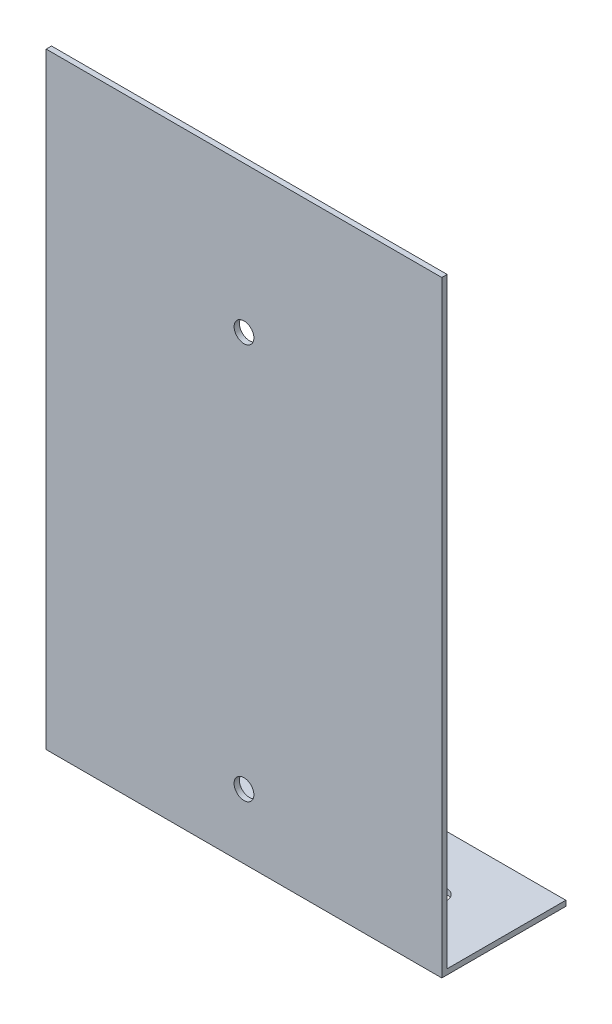
ISO-10303-21;
HEADER;
FILE_DESCRIPTION(('STEP AP214'),'2;1');
FILE_NAME('part.step','',(''),(''),'','','');
FILE_SCHEMA(('AUTOMOTIVE_DESIGN { 1 0 10303 214 1 1 1 1 }'));
ENDSEC;
DATA;
#1=APPLICATION_CONTEXT('core data for automotive mechanical design processes');
#2=APPLICATION_PROTOCOL_DEFINITION('international standard','automotive_design',2000,#1);
#3=PRODUCT_CONTEXT('',#1,'mechanical');
#4=PRODUCT('Part','Part','',(#3));
#5=PRODUCT_RELATED_PRODUCT_CATEGORY('part','',(#4));
#6=PRODUCT_DEFINITION_FORMATION('','',#4);
#7=PRODUCT_DEFINITION_CONTEXT('part definition',#1,'design');
#8=PRODUCT_DEFINITION('design','',#6,#7);
#9=PRODUCT_DEFINITION_SHAPE('','',#8);
#10=(LENGTH_UNIT() NAMED_UNIT(*) SI_UNIT(.MILLI.,.METRE.));
#11=(NAMED_UNIT(*) PLANE_ANGLE_UNIT() SI_UNIT($,.RADIAN.));
#12=(NAMED_UNIT(*) SI_UNIT($,.STERADIAN.) SOLID_ANGLE_UNIT());
#13=UNCERTAINTY_MEASURE_WITH_UNIT(LENGTH_MEASURE(1.E-05),#10,'distance_accuracy_value','');
#14=(GEOMETRIC_REPRESENTATION_CONTEXT(3) GLOBAL_UNCERTAINTY_ASSIGNED_CONTEXT((#13)) GLOBAL_UNIT_ASSIGNED_CONTEXT((#10,
#11,#12)) REPRESENTATION_CONTEXT('',''));
#15=CARTESIAN_POINT('',(0.,0.,0.));
#16=DIRECTION('',(0.,0.,1.));
#17=DIRECTION('',(1.,0.,0.));
#18=AXIS2_PLACEMENT_3D('',#15,#16,#17);
#19=CARTESIAN_POINT('',(0.,2.7,0.));
#20=DIRECTION('',(0.,1.,0.));
#21=DIRECTION('',(0.,0.,1.));
#22=AXIS2_PLACEMENT_3D('',#19,#20,#21);
#23=PLANE('',#22);
#24=CARTESIAN_POINT('',(35.,2.7,-30.));
#25=DIRECTION('',(0.,1.,0.));
#26=DIRECTION('',(0.,0.,1.));
#27=AXIS2_PLACEMENT_3D('',#24,#25,#26);
#28=CIRCLE('',#27,5.);
#29=CARTESIAN_POINT('',(35.,2.7,-35.));
#30=VERTEX_POINT('',#29);
#31=EDGE_CURVE('E110',#30,#30,#28,.T.);
#32=ORIENTED_EDGE('',*,*,#31,.F.);
#33=EDGE_LOOP('',(#32));
#34=FACE_BOUND('',#33,.T.);
#35=DIRECTION('',(0.,0.,1.));
#36=VECTOR('',#35,1.);
#37=CARTESIAN_POINT('',(0.,2.7,-60.));
#38=LINE('',#37,#36);
#39=CARTESIAN_POINT('',(0.,2.7,-60.));
#40=VERTEX_POINT('',#39);
#41=CARTESIAN_POINT('',(0.,2.7,0.));
#42=VERTEX_POINT('',#41);
#43=EDGE_CURVE('E100',#40,#42,#38,.T.);
#44=ORIENTED_EDGE('',*,*,#43,.T.);
#45=DIRECTION('',(1.,0.,0.));
#46=VECTOR('',#45,1.);
#47=CARTESIAN_POINT('',(0.,2.7,0.));
#48=LINE('',#47,#46);
#49=CARTESIAN_POINT('',(200.,2.7,0.));
#50=VERTEX_POINT('',#49);
#51=EDGE_CURVE('E77',#42,#50,#48,.T.);
#52=ORIENTED_EDGE('',*,*,#51,.T.);
#53=DIRECTION('',(0.,0.,-1.));
#54=VECTOR('',#53,1.);
#55=CARTESIAN_POINT('',(200.,2.7,-60.));
#56=LINE('',#55,#54);
#57=CARTESIAN_POINT('',(200.,2.7,-60.));
#58=VERTEX_POINT('',#57);
#59=EDGE_CURVE('E98',#50,#58,#56,.T.);
#60=ORIENTED_EDGE('',*,*,#59,.T.);
#61=DIRECTION('',(-1.,0.,0.));
#62=VECTOR('',#61,1.);
#63=CARTESIAN_POINT('',(0.,2.7,-60.));
#64=LINE('',#63,#62);
#65=EDGE_CURVE('E56',#58,#40,#64,.T.);
#66=ORIENTED_EDGE('',*,*,#65,.T.);
#67=EDGE_LOOP('',(#44,#52,#60,#66));
#68=FACE_BOUND('',#67,.T.);
#69=CARTESIAN_POINT('',(165.,2.7,-30.));
#70=DIRECTION('',(0.,1.,0.));
#71=DIRECTION('',(0.,0.,1.));
#72=AXIS2_PLACEMENT_3D('',#69,#70,#71);
#73=CIRCLE('',#72,5.00000000000002);
#74=CARTESIAN_POINT('',(165.,2.7,-35.));
#75=VERTEX_POINT('',#74);
#76=EDGE_CURVE('E155',#75,#75,#73,.T.);
#77=ORIENTED_EDGE('',*,*,#76,.F.);
#78=EDGE_LOOP('',(#77));
#79=FACE_BOUND('',#78,.T.);
#80=ADVANCED_FACE('F39',(#34,#68,#79),#23,.T.);
#81=CARTESIAN_POINT('',(0.,0.,0.));
#82=DIRECTION('',(0.,1.,0.));
#83=DIRECTION('',(0.,0.,1.));
#84=AXIS2_PLACEMENT_3D('',#81,#82,#83);
#85=PLANE('',#84);
#86=DIRECTION('',(0.,0.,1.));
#87=VECTOR('',#86,1.);
#88=CARTESIAN_POINT('',(0.,0.,-60.));
#89=LINE('',#88,#87);
#90=CARTESIAN_POINT('',(0.,0.,-60.));
#91=VERTEX_POINT('',#90);
#92=CARTESIAN_POINT('',(0.,0.,2.7));
#93=VERTEX_POINT('',#92);
#94=EDGE_CURVE('E107',#91,#93,#89,.T.);
#95=ORIENTED_EDGE('',*,*,#94,.F.);
#96=DIRECTION('',(-1.,0.,0.));
#97=VECTOR('',#96,1.);
#98=CARTESIAN_POINT('',(0.,0.,-60.));
#99=LINE('',#98,#97);
#100=CARTESIAN_POINT('',(200.,0.,-60.));
#101=VERTEX_POINT('',#100);
#102=EDGE_CURVE('E112',#101,#91,#99,.T.);
#103=ORIENTED_EDGE('',*,*,#102,.F.);
#104=DIRECTION('',(0.,0.,-1.));
#105=VECTOR('',#104,1.);
#106=CARTESIAN_POINT('',(200.,0.,-60.));
#107=LINE('',#106,#105);
#108=CARTESIAN_POINT('',(200.,0.,2.7));
#109=VERTEX_POINT('',#108);
#110=EDGE_CURVE('E68',#109,#101,#107,.T.);
#111=ORIENTED_EDGE('',*,*,#110,.F.);
#112=DIRECTION('',(1.,0.,0.));
#113=VECTOR('',#112,1.);
#114=CARTESIAN_POINT('',(0.,0.,2.7));
#115=LINE('',#114,#113);
#116=EDGE_CURVE('E125',#93,#109,#115,.T.);
#117=ORIENTED_EDGE('',*,*,#116,.F.);
#118=EDGE_LOOP('',(#95,#103,#111,#117));
#119=FACE_BOUND('',#118,.T.);
#120=CARTESIAN_POINT('',(35.,0.,-30.));
#121=DIRECTION('',(0.,1.,0.));
#122=DIRECTION('',(0.,0.,1.));
#123=AXIS2_PLACEMENT_3D('',#120,#121,#122);
#124=CIRCLE('',#123,5.);
#125=CARTESIAN_POINT('',(35.,0.,-35.));
#126=VERTEX_POINT('',#125);
#127=EDGE_CURVE('E158',#126,#126,#124,.T.);
#128=ORIENTED_EDGE('',*,*,#127,.T.);
#129=EDGE_LOOP('',(#128));
#130=FACE_BOUND('',#129,.T.);
#131=CARTESIAN_POINT('',(165.,0.,-30.));
#132=DIRECTION('',(0.,1.,0.));
#133=DIRECTION('',(0.,0.,1.));
#134=AXIS2_PLACEMENT_3D('',#131,#132,#133);
#135=CIRCLE('',#134,5.00000000000002);
#136=CARTESIAN_POINT('',(165.,0.,-35.));
#137=VERTEX_POINT('',#136);
#138=EDGE_CURVE('E154',#137,#137,#135,.T.);
#139=ORIENTED_EDGE('',*,*,#138,.T.);
#140=EDGE_LOOP('',(#139));
#141=FACE_BOUND('',#140,.T.);
#142=ADVANCED_FACE('F122',(#119,#130,#141),#85,.F.);
#143=CARTESIAN_POINT('',(0.,2.7,-60.));
#144=DIRECTION('',(1.,0.,0.));
#145=DIRECTION('',(0.,0.,-1.));
#146=AXIS2_PLACEMENT_3D('',#143,#144,#145);
#147=PLANE('',#146);
#148=ORIENTED_EDGE('',*,*,#94,.T.);
#149=DIRECTION('',(0.,-1.,0.));
#150=VECTOR('',#149,1.);
#151=CARTESIAN_POINT('',(0.,0.,2.7));
#152=LINE('',#151,#150);
#153=CARTESIAN_POINT('',(0.,306.7,2.7));
#154=VERTEX_POINT('',#153);
#155=EDGE_CURVE('E132',#154,#93,#152,.T.);
#156=ORIENTED_EDGE('',*,*,#155,.F.);
#157=DIRECTION('',(0.,0.,-1.));
#158=VECTOR('',#157,1.);
#159=CARTESIAN_POINT('',(0.,306.7,2.7));
#160=LINE('',#159,#158);
#161=CARTESIAN_POINT('',(0.,306.7,0.));
#162=VERTEX_POINT('',#161);
#163=EDGE_CURVE('E148',#154,#162,#160,.T.);
#164=ORIENTED_EDGE('',*,*,#163,.T.);
#165=DIRECTION('',(0.,-1.,0.));
#166=VECTOR('',#165,1.);
#167=CARTESIAN_POINT('',(0.,0.,0.));
#168=LINE('',#167,#166);
#169=EDGE_CURVE('E95',#162,#42,#168,.T.);
#170=ORIENTED_EDGE('',*,*,#169,.T.);
#171=ORIENTED_EDGE('',*,*,#43,.F.);
#172=DIRECTION('',(0.,-1.,0.));
#173=VECTOR('',#172,1.);
#174=CARTESIAN_POINT('',(0.,2.7,-60.));
#175=LINE('',#174,#173);
#176=EDGE_CURVE('E48',#40,#91,#175,.T.);
#177=ORIENTED_EDGE('',*,*,#176,.T.);
#178=EDGE_LOOP('',(#148,#156,#164,#170,#171,#177));
#179=FACE_BOUND('',#178,.T.);
#180=ADVANCED_FACE('F41',(#179),#147,.F.);
#181=CARTESIAN_POINT('',(200.,2.7,-60.));
#182=DIRECTION('',(-1.,0.,0.));
#183=DIRECTION('',(0.,0.,1.));
#184=AXIS2_PLACEMENT_3D('',#181,#182,#183);
#185=PLANE('',#184);
#186=ORIENTED_EDGE('',*,*,#110,.T.);
#187=DIRECTION('',(0.,-1.,0.));
#188=VECTOR('',#187,1.);
#189=CARTESIAN_POINT('',(200.,2.7,-60.));
#190=LINE('',#189,#188);
#191=EDGE_CURVE('E11',#58,#101,#190,.T.);
#192=ORIENTED_EDGE('',*,*,#191,.F.);
#193=ORIENTED_EDGE('',*,*,#59,.F.);
#194=DIRECTION('',(0.,1.,0.));
#195=VECTOR('',#194,1.);
#196=CARTESIAN_POINT('',(200.,0.,0.));
#197=LINE('',#196,#195);
#198=CARTESIAN_POINT('',(200.,306.7,0.));
#199=VERTEX_POINT('',#198);
#200=EDGE_CURVE('E87',#50,#199,#197,.T.);
#201=ORIENTED_EDGE('',*,*,#200,.T.);
#202=DIRECTION('',(0.,0.,-1.));
#203=VECTOR('',#202,1.);
#204=CARTESIAN_POINT('',(200.,306.7,2.7));
#205=LINE('',#204,#203);
#206=CARTESIAN_POINT('',(200.,306.7,2.7));
#207=VERTEX_POINT('',#206);
#208=EDGE_CURVE('E152',#207,#199,#205,.T.);
#209=ORIENTED_EDGE('',*,*,#208,.F.);
#210=DIRECTION('',(0.,1.,0.));
#211=VECTOR('',#210,1.);
#212=CARTESIAN_POINT('',(200.,0.,2.7));
#213=LINE('',#212,#211);
#214=EDGE_CURVE('E131',#109,#207,#213,.T.);
#215=ORIENTED_EDGE('',*,*,#214,.F.);
#216=EDGE_LOOP('',(#186,#192,#193,#201,#209,#215));
#217=FACE_BOUND('',#216,.T.);
#218=ADVANCED_FACE('F102',(#217),#185,.F.);
#219=CARTESIAN_POINT('',(0.,2.7,-60.));
#220=DIRECTION('',(0.,0.,1.));
#221=DIRECTION('',(1.,0.,0.));
#222=AXIS2_PLACEMENT_3D('',#219,#220,#221);
#223=PLANE('',#222);
#224=ORIENTED_EDGE('',*,*,#102,.T.);
#225=ORIENTED_EDGE('',*,*,#176,.F.);
#226=ORIENTED_EDGE('',*,*,#65,.F.);
#227=ORIENTED_EDGE('',*,*,#191,.T.);
#228=EDGE_LOOP('',(#224,#225,#226,#227));
#229=FACE_BOUND('',#228,.T.);
#230=ADVANCED_FACE('F170',(#229),#223,.F.);
#231=CARTESIAN_POINT('',(35.,2.7,-30.));
#232=DIRECTION('',(0.,-1.,0.));
#233=DIRECTION('',(0.,0.,-1.));
#234=AXIS2_PLACEMENT_3D('',#231,#232,#233);
#235=CYLINDRICAL_SURFACE('',#234,5.);
#236=CARTESIAN_POINT('',(35.,2.7,-35.));
#237=CARTESIAN_POINT('',(35.,2.671875,-35.));
#238=CARTESIAN_POINT('',(35.,2.64375,-35.));
#239=CARTESIAN_POINT('',(35.,2.5875,-35.));
#240=CARTESIAN_POINT('',(35.,2.559375,-35.));
#241=CARTESIAN_POINT('',(35.,2.503125,-35.));
#242=CARTESIAN_POINT('',(35.,2.475,-35.));
#243=CARTESIAN_POINT('',(35.,2.41875,-35.));
#244=CARTESIAN_POINT('',(35.,2.390625,-35.));
#245=CARTESIAN_POINT('',(35.,2.334375,-35.));
#246=CARTESIAN_POINT('',(35.,2.30625,-35.));
#247=CARTESIAN_POINT('',(35.,2.25,-35.));
#248=CARTESIAN_POINT('',(35.,2.221875,-35.));
#249=CARTESIAN_POINT('',(35.,2.165625,-35.));
#250=CARTESIAN_POINT('',(35.,2.1375,-35.));
#251=CARTESIAN_POINT('',(35.,2.08125,-35.));
#252=CARTESIAN_POINT('',(35.,2.053125,-35.));
#253=CARTESIAN_POINT('',(35.,1.996875,-35.));
#254=CARTESIAN_POINT('',(35.,1.96875,-35.));
#255=CARTESIAN_POINT('',(35.,1.9125,-35.));
#256=CARTESIAN_POINT('',(35.,1.884375,-35.));
#257=CARTESIAN_POINT('',(35.,1.828125,-35.));
#258=CARTESIAN_POINT('',(35.,1.8,-35.));
#259=CARTESIAN_POINT('',(35.,1.74375,-35.));
#260=CARTESIAN_POINT('',(35.,1.715625,-35.));
#261=CARTESIAN_POINT('',(35.,1.659375,-35.));
#262=CARTESIAN_POINT('',(35.,1.63125,-35.));
#263=CARTESIAN_POINT('',(35.,1.575,-35.));
#264=CARTESIAN_POINT('',(35.,1.546875,-35.));
#265=CARTESIAN_POINT('',(35.,1.490625,-35.));
#266=CARTESIAN_POINT('',(35.,1.4625,-35.));
#267=CARTESIAN_POINT('',(35.,1.40625,-35.));
#268=CARTESIAN_POINT('',(35.,1.378125,-35.));
#269=CARTESIAN_POINT('',(35.,1.321875,-35.));
#270=CARTESIAN_POINT('',(35.,1.29375,-35.));
#271=CARTESIAN_POINT('',(35.,1.2375,-35.));
#272=CARTESIAN_POINT('',(35.,1.209375,-35.));
#273=CARTESIAN_POINT('',(35.,1.153125,-35.));
#274=CARTESIAN_POINT('',(35.,1.125,-35.));
#275=CARTESIAN_POINT('',(35.,1.06875,-35.));
#276=CARTESIAN_POINT('',(35.,1.040625,-35.));
#277=CARTESIAN_POINT('',(35.,0.984375,-35.));
#278=CARTESIAN_POINT('',(35.,0.95625,-35.));
#279=CARTESIAN_POINT('',(35.,0.9,-35.));
#280=CARTESIAN_POINT('',(35.,0.871875,-35.));
#281=CARTESIAN_POINT('',(35.,0.815625,-35.));
#282=CARTESIAN_POINT('',(35.,0.7875,-35.));
#283=CARTESIAN_POINT('',(35.,0.73125,-35.));
#284=CARTESIAN_POINT('',(35.,0.703125,-35.));
#285=CARTESIAN_POINT('',(35.,0.646875,-35.));
#286=CARTESIAN_POINT('',(35.,0.61875,-35.));
#287=CARTESIAN_POINT('',(35.,0.5625,-35.));
#288=CARTESIAN_POINT('',(35.,0.534375,-35.));
#289=CARTESIAN_POINT('',(35.,0.478125,-35.));
#290=CARTESIAN_POINT('',(35.,0.45,-35.));
#291=CARTESIAN_POINT('',(35.,0.39375,-35.));
#292=CARTESIAN_POINT('',(35.,0.365625,-35.));
#293=CARTESIAN_POINT('',(35.,0.309375,-35.));
#294=CARTESIAN_POINT('',(35.,0.28125,-35.));
#295=CARTESIAN_POINT('',(35.,0.225,-35.));
#296=CARTESIAN_POINT('',(35.,0.196875,-35.));
#297=CARTESIAN_POINT('',(35.,0.140625,-35.));
#298=CARTESIAN_POINT('',(35.,0.112499999999999,-35.));
#299=CARTESIAN_POINT('',(35.,0.0562499999999994,-35.));
#300=CARTESIAN_POINT('',(35.,0.0281249999999995,-35.));
#301=CARTESIAN_POINT('',(35.,0.,-35.));
#302=B_SPLINE_CURVE_WITH_KNOTS('',3,(#236,#237,#238,#239,#240,#241,#242,#243,#244,#245,#246,
#247,#248,#249,#250,#251,#252,#253,#254,#255,#256,#257,#258,#259,#260,#261,#262,#263,#264,#265,
#266,#267,#268,#269,#270,#271,#272,#273,#274,#275,#276,#277,#278,#279,#280,#281,#282,#283,#284,
#285,#286,#287,#288,#289,#290,#291,#292,#293,#294,#295,#296,#297,#298,#299,#300,#301),
.UNSPECIFIED.,.F.,.F.,(4,2,2,2,2,2,2,2,2,2,2,2,2,2,2,2,2,2,2,2,2,2,2,2,2,2,2,2,2,2,2,2,4),(0.,
0.0843749999999998,0.16875,0.253125,0.3375,0.421875,0.50625,0.590625,0.675,0.759375,0.84375,
0.928125,1.0125,1.096875,1.18125,1.265625,1.35,1.434375,1.51875,1.603125,1.6875,1.771875,
1.85625,1.940625,2.025,2.109375,2.19375,2.278125,2.3625,2.446875,2.53125,2.615625,2.7),.UNSPECIFIED.);
#303=EDGE_CURVE('BSEAM167',#30,#126,#302,.T.);
#304=ORIENTED_EDGE('',*,*,#31,.T.);
#305=ORIENTED_EDGE('',*,*,#127,.F.);
#306=ORIENTED_EDGE('',*,*,#303,.T.);
#307=ORIENTED_EDGE('',*,*,#303,.F.);
#308=EDGE_LOOP('',(#304,#306,#305,#307));
#309=FACE_BOUND('',#308,.T.);
#310=ADVANCED_FACE('F167',(#309),#235,.F.);
#311=CARTESIAN_POINT('',(165.,2.7,-30.));
#312=DIRECTION('',(0.,-1.,0.));
#313=DIRECTION('',(0.,0.,-1.));
#314=AXIS2_PLACEMENT_3D('',#311,#312,#313);
#315=CYLINDRICAL_SURFACE('',#314,5.00000000000002);
#316=CARTESIAN_POINT('',(165.,2.7,-35.));
#317=CARTESIAN_POINT('',(165.,2.671875,-35.));
#318=CARTESIAN_POINT('',(165.,2.64375,-35.));
#319=CARTESIAN_POINT('',(165.,2.5875,-35.));
#320=CARTESIAN_POINT('',(165.,2.559375,-35.));
#321=CARTESIAN_POINT('',(165.,2.503125,-35.));
#322=CARTESIAN_POINT('',(165.,2.475,-35.));
#323=CARTESIAN_POINT('',(165.,2.41875,-35.));
#324=CARTESIAN_POINT('',(165.,2.390625,-35.));
#325=CARTESIAN_POINT('',(165.,2.334375,-35.));
#326=CARTESIAN_POINT('',(165.,2.30625,-35.));
#327=CARTESIAN_POINT('',(165.,2.25,-35.));
#328=CARTESIAN_POINT('',(165.,2.221875,-35.));
#329=CARTESIAN_POINT('',(165.,2.165625,-35.));
#330=CARTESIAN_POINT('',(165.,2.1375,-35.));
#331=CARTESIAN_POINT('',(165.,2.08125,-35.));
#332=CARTESIAN_POINT('',(165.,2.053125,-35.));
#333=CARTESIAN_POINT('',(165.,1.996875,-35.));
#334=CARTESIAN_POINT('',(165.,1.96875,-35.));
#335=CARTESIAN_POINT('',(165.,1.9125,-35.));
#336=CARTESIAN_POINT('',(165.,1.884375,-35.));
#337=CARTESIAN_POINT('',(165.,1.828125,-35.));
#338=CARTESIAN_POINT('',(165.,1.8,-35.));
#339=CARTESIAN_POINT('',(165.,1.74375,-35.));
#340=CARTESIAN_POINT('',(165.,1.715625,-35.));
#341=CARTESIAN_POINT('',(165.,1.659375,-35.));
#342=CARTESIAN_POINT('',(165.,1.63125,-35.));
#343=CARTESIAN_POINT('',(165.,1.575,-35.));
#344=CARTESIAN_POINT('',(165.,1.546875,-35.));
#345=CARTESIAN_POINT('',(165.,1.490625,-35.));
#346=CARTESIAN_POINT('',(165.,1.4625,-35.));
#347=CARTESIAN_POINT('',(165.,1.40625,-35.));
#348=CARTESIAN_POINT('',(165.,1.378125,-35.));
#349=CARTESIAN_POINT('',(165.,1.321875,-35.));
#350=CARTESIAN_POINT('',(165.,1.29375,-35.));
#351=CARTESIAN_POINT('',(165.,1.2375,-35.));
#352=CARTESIAN_POINT('',(165.,1.209375,-35.));
#353=CARTESIAN_POINT('',(165.,1.153125,-35.));
#354=CARTESIAN_POINT('',(165.,1.125,-35.));
#355=CARTESIAN_POINT('',(165.,1.06875,-35.));
#356=CARTESIAN_POINT('',(165.,1.040625,-35.));
#357=CARTESIAN_POINT('',(165.,0.984375,-35.));
#358=CARTESIAN_POINT('',(165.,0.95625,-35.));
#359=CARTESIAN_POINT('',(165.,0.9,-35.));
#360=CARTESIAN_POINT('',(165.,0.871875,-35.));
#361=CARTESIAN_POINT('',(165.,0.815625,-35.));
#362=CARTESIAN_POINT('',(165.,0.7875,-35.));
#363=CARTESIAN_POINT('',(165.,0.73125,-35.));
#364=CARTESIAN_POINT('',(165.,0.703125,-35.));
#365=CARTESIAN_POINT('',(165.,0.646875,-35.));
#366=CARTESIAN_POINT('',(165.,0.61875,-35.));
#367=CARTESIAN_POINT('',(165.,0.5625,-35.));
#368=CARTESIAN_POINT('',(165.,0.534375,-35.));
#369=CARTESIAN_POINT('',(165.,0.478125,-35.));
#370=CARTESIAN_POINT('',(165.,0.45,-35.));
#371=CARTESIAN_POINT('',(165.,0.39375,-35.));
#372=CARTESIAN_POINT('',(165.,0.365625,-35.));
#373=CARTESIAN_POINT('',(165.,0.309375,-35.));
#374=CARTESIAN_POINT('',(165.,0.28125,-35.));
#375=CARTESIAN_POINT('',(165.,0.225,-35.));
#376=CARTESIAN_POINT('',(165.,0.196875,-35.));
#377=CARTESIAN_POINT('',(165.,0.140625,-35.));
#378=CARTESIAN_POINT('',(165.,0.112499999999999,-35.));
#379=CARTESIAN_POINT('',(165.,0.0562499999999994,-35.));
#380=CARTESIAN_POINT('',(165.,0.0281249999999995,-35.));
#381=CARTESIAN_POINT('',(165.,0.,-35.));
#382=B_SPLINE_CURVE_WITH_KNOTS('',3,(#316,#317,#318,#319,#320,#321,#322,#323,#324,#325,#326,
#327,#328,#329,#330,#331,#332,#333,#334,#335,#336,#337,#338,#339,#340,#341,#342,#343,#344,#345,
#346,#347,#348,#349,#350,#351,#352,#353,#354,#355,#356,#357,#358,#359,#360,#361,#362,#363,#364,
#365,#366,#367,#368,#369,#370,#371,#372,#373,#374,#375,#376,#377,#378,#379,#380,#381),
.UNSPECIFIED.,.F.,.F.,(4,2,2,2,2,2,2,2,2,2,2,2,2,2,2,2,2,2,2,2,2,2,2,2,2,2,2,2,2,2,2,2,4),(0.,
0.0843749999999998,0.16875,0.253125,0.3375,0.421875,0.50625,0.590625,0.675,0.759375,0.84375,
0.928125,1.0125,1.096875,1.18125,1.265625,1.35,1.434375,1.51875,1.603125,1.6875,1.771875,
1.85625,1.940625,2.025,2.109375,2.19375,2.278125,2.3625,2.446875,2.53125,2.615625,2.7),.UNSPECIFIED.);
#383=EDGE_CURVE('BSEAM169',#75,#137,#382,.T.);
#384=ORIENTED_EDGE('',*,*,#76,.T.);
#385=ORIENTED_EDGE('',*,*,#138,.F.);
#386=ORIENTED_EDGE('',*,*,#383,.T.);
#387=ORIENTED_EDGE('',*,*,#383,.F.);
#388=EDGE_LOOP('',(#384,#386,#385,#387));
#389=FACE_BOUND('',#388,.T.);
#390=ADVANCED_FACE('F169',(#389),#315,.F.);
#391=CARTESIAN_POINT('',(0.,0.,0.));
#392=DIRECTION('',(0.,0.,-1.));
#393=DIRECTION('',(-1.,0.,0.));
#394=AXIS2_PLACEMENT_3D('',#391,#392,#393);
#395=PLANE('',#394);
#396=CARTESIAN_POINT('',(100.,32.7,0.));
#397=DIRECTION('',(0.,0.,1.));
#398=DIRECTION('',(1.,0.,0.));
#399=AXIS2_PLACEMENT_3D('',#396,#397,#398);
#400=CIRCLE('',#399,5.00000000000001);
#401=CARTESIAN_POINT('',(95.,32.7,0.));
#402=VERTEX_POINT('',#401);
#403=EDGE_CURVE('E312',#402,#402,#400,.T.);
#404=ORIENTED_EDGE('',*,*,#403,.T.);
#405=EDGE_LOOP('',(#404));
#406=FACE_BOUND('',#405,.T.);
#407=CARTESIAN_POINT('',(100.,232.7,0.));
#408=DIRECTION('',(0.,0.,1.));
#409=DIRECTION('',(1.,0.,0.));
#410=AXIS2_PLACEMENT_3D('',#407,#408,#409);
#411=CIRCLE('',#410,5.00000000000001);
#412=CARTESIAN_POINT('',(95.,232.7,0.));
#413=VERTEX_POINT('',#412);
#414=EDGE_CURVE('E143',#413,#413,#411,.T.);
#415=ORIENTED_EDGE('',*,*,#414,.T.);
#416=EDGE_LOOP('',(#415));
#417=FACE_BOUND('',#416,.T.);
#418=ORIENTED_EDGE('',*,*,#51,.F.);
#419=ORIENTED_EDGE('',*,*,#169,.F.);
#420=DIRECTION('',(-1.,0.,0.));
#421=VECTOR('',#420,1.);
#422=CARTESIAN_POINT('',(0.,306.7,0.));
#423=LINE('',#422,#421);
#424=EDGE_CURVE('E91',#199,#162,#423,.T.);
#425=ORIENTED_EDGE('',*,*,#424,.F.);
#426=ORIENTED_EDGE('',*,*,#200,.F.);
#427=EDGE_LOOP('',(#418,#419,#425,#426));
#428=FACE_BOUND('',#427,.T.);
#429=ADVANCED_FACE('F88',(#406,#417,#428),#395,.T.);
#430=CARTESIAN_POINT('',(0.,0.,2.7));
#431=DIRECTION('',(0.,0.,-1.));
#432=DIRECTION('',(-1.,0.,0.));
#433=AXIS2_PLACEMENT_3D('',#430,#431,#432);
#434=PLANE('',#433);
#435=ORIENTED_EDGE('',*,*,#155,.T.);
#436=ORIENTED_EDGE('',*,*,#116,.T.);
#437=ORIENTED_EDGE('',*,*,#214,.T.);
#438=DIRECTION('',(-1.,0.,0.));
#439=VECTOR('',#438,1.);
#440=CARTESIAN_POINT('',(0.,306.7,2.7));
#441=LINE('',#440,#439);
#442=EDGE_CURVE('E137',#207,#154,#441,.T.);
#443=ORIENTED_EDGE('',*,*,#442,.T.);
#444=EDGE_LOOP('',(#435,#436,#437,#443));
#445=FACE_BOUND('',#444,.T.);
#446=CARTESIAN_POINT('',(100.,232.7,2.7));
#447=DIRECTION('',(0.,0.,1.));
#448=DIRECTION('',(1.,0.,0.));
#449=AXIS2_PLACEMENT_3D('',#446,#447,#448);
#450=CIRCLE('',#449,5.00000000000001);
#451=CARTESIAN_POINT('',(95.,232.7,2.7));
#452=VERTEX_POINT('',#451);
#453=EDGE_CURVE('E149',#452,#452,#450,.T.);
#454=ORIENTED_EDGE('',*,*,#453,.F.);
#455=EDGE_LOOP('',(#454));
#456=FACE_BOUND('',#455,.T.);
#457=CARTESIAN_POINT('',(100.,32.7,2.7));
#458=DIRECTION('',(0.,0.,1.));
#459=DIRECTION('',(1.,0.,0.));
#460=AXIS2_PLACEMENT_3D('',#457,#458,#459);
#461=CIRCLE('',#460,5.00000000000001);
#462=CARTESIAN_POINT('',(95.,32.7,2.7));
#463=VERTEX_POINT('',#462);
#464=EDGE_CURVE('E309',#463,#463,#461,.T.);
#465=ORIENTED_EDGE('',*,*,#464,.F.);
#466=EDGE_LOOP('',(#465));
#467=FACE_BOUND('',#466,.T.);
#468=ADVANCED_FACE('F134',(#445,#456,#467),#434,.F.);
#469=CARTESIAN_POINT('',(0.,306.7,2.7));
#470=DIRECTION('',(0.,-1.,0.));
#471=DIRECTION('',(0.,0.,-1.));
#472=AXIS2_PLACEMENT_3D('',#469,#470,#471);
#473=PLANE('',#472);
#474=ORIENTED_EDGE('',*,*,#424,.T.);
#475=ORIENTED_EDGE('',*,*,#163,.F.);
#476=ORIENTED_EDGE('',*,*,#442,.F.);
#477=ORIENTED_EDGE('',*,*,#208,.T.);
#478=EDGE_LOOP('',(#474,#475,#476,#477));
#479=FACE_BOUND('',#478,.T.);
#480=ADVANCED_FACE('F266',(#479),#473,.F.);
#481=CARTESIAN_POINT('',(100.,232.7,2.7));
#482=DIRECTION('',(0.,0.,-1.));
#483=DIRECTION('',(-1.,0.,0.));
#484=AXIS2_PLACEMENT_3D('',#481,#482,#483);
#485=CYLINDRICAL_SURFACE('',#484,5.00000000000001);
#486=CARTESIAN_POINT('',(95.,232.7,2.7));
#487=CARTESIAN_POINT('',(95.,232.7,2.671875));
#488=CARTESIAN_POINT('',(95.,232.7,2.64375));
#489=CARTESIAN_POINT('',(95.,232.7,2.5875));
#490=CARTESIAN_POINT('',(95.,232.7,2.559375));
#491=CARTESIAN_POINT('',(95.,232.7,2.503125));
#492=CARTESIAN_POINT('',(95.,232.7,2.475));
#493=CARTESIAN_POINT('',(95.,232.7,2.41875));
#494=CARTESIAN_POINT('',(95.,232.7,2.390625));
#495=CARTESIAN_POINT('',(95.,232.7,2.334375));
#496=CARTESIAN_POINT('',(95.,232.7,2.30625));
#497=CARTESIAN_POINT('',(95.,232.7,2.25));
#498=CARTESIAN_POINT('',(95.,232.7,2.221875));
#499=CARTESIAN_POINT('',(95.,232.7,2.165625));
#500=CARTESIAN_POINT('',(95.,232.7,2.1375));
#501=CARTESIAN_POINT('',(95.,232.7,2.08125));
#502=CARTESIAN_POINT('',(95.,232.7,2.053125));
#503=CARTESIAN_POINT('',(95.,232.7,1.996875));
#504=CARTESIAN_POINT('',(95.,232.7,1.96875));
#505=CARTESIAN_POINT('',(95.,232.7,1.9125));
#506=CARTESIAN_POINT('',(95.,232.7,1.884375));
#507=CARTESIAN_POINT('',(95.,232.7,1.828125));
#508=CARTESIAN_POINT('',(95.,232.7,1.8));
#509=CARTESIAN_POINT('',(95.,232.7,1.74375));
#510=CARTESIAN_POINT('',(95.,232.7,1.715625));
#511=CARTESIAN_POINT('',(95.,232.7,1.659375));
#512=CARTESIAN_POINT('',(95.,232.7,1.63125));
#513=CARTESIAN_POINT('',(95.,232.7,1.575));
#514=CARTESIAN_POINT('',(95.,232.7,1.546875));
#515=CARTESIAN_POINT('',(95.,232.7,1.490625));
#516=CARTESIAN_POINT('',(95.,232.7,1.4625));
#517=CARTESIAN_POINT('',(95.,232.7,1.40625));
#518=CARTESIAN_POINT('',(95.,232.7,1.378125));
#519=CARTESIAN_POINT('',(95.,232.7,1.321875));
#520=CARTESIAN_POINT('',(95.,232.7,1.29375));
#521=CARTESIAN_POINT('',(95.,232.7,1.2375));
#522=CARTESIAN_POINT('',(95.,232.7,1.209375));
#523=CARTESIAN_POINT('',(95.,232.7,1.153125));
#524=CARTESIAN_POINT('',(95.,232.7,1.125));
#525=CARTESIAN_POINT('',(95.,232.7,1.06875));
#526=CARTESIAN_POINT('',(95.,232.7,1.040625));
#527=CARTESIAN_POINT('',(95.,232.7,0.984375));
#528=CARTESIAN_POINT('',(95.,232.7,0.95625));
#529=CARTESIAN_POINT('',(95.,232.7,0.9));
#530=CARTESIAN_POINT('',(95.,232.7,0.871875));
#531=CARTESIAN_POINT('',(95.,232.7,0.815625));
#532=CARTESIAN_POINT('',(95.,232.7,0.7875));
#533=CARTESIAN_POINT('',(95.,232.7,0.73125));
#534=CARTESIAN_POINT('',(95.,232.7,0.703125));
#535=CARTESIAN_POINT('',(95.,232.7,0.646875));
#536=CARTESIAN_POINT('',(95.,232.7,0.61875));
#537=CARTESIAN_POINT('',(95.,232.7,0.5625));
#538=CARTESIAN_POINT('',(95.,232.7,0.534375));
#539=CARTESIAN_POINT('',(95.,232.7,0.478125));
#540=CARTESIAN_POINT('',(95.,232.7,0.45));
#541=CARTESIAN_POINT('',(95.,232.7,0.39375));
#542=CARTESIAN_POINT('',(95.,232.7,0.365625));
#543=CARTESIAN_POINT('',(95.,232.7,0.309375));
#544=CARTESIAN_POINT('',(95.,232.7,0.28125));
#545=CARTESIAN_POINT('',(95.,232.7,0.225));
#546=CARTESIAN_POINT('',(95.,232.7,0.196875));
#547=CARTESIAN_POINT('',(95.,232.7,0.140625));
#548=CARTESIAN_POINT('',(95.,232.7,0.112499999999999));
#549=CARTESIAN_POINT('',(95.,232.7,0.0562499999999994));
#550=CARTESIAN_POINT('',(95.,232.7,0.0281249999999995));
#551=CARTESIAN_POINT('',(95.,232.7,0.));
#552=B_SPLINE_CURVE_WITH_KNOTS('',3,(#486,#487,#488,#489,#490,#491,#492,#493,#494,#495,#496,
#497,#498,#499,#500,#501,#502,#503,#504,#505,#506,#507,#508,#509,#510,#511,#512,#513,#514,#515,
#516,#517,#518,#519,#520,#521,#522,#523,#524,#525,#526,#527,#528,#529,#530,#531,#532,#533,#534,
#535,#536,#537,#538,#539,#540,#541,#542,#543,#544,#545,#546,#547,#548,#549,#550,#551),
.UNSPECIFIED.,.F.,.F.,(4,2,2,2,2,2,2,2,2,2,2,2,2,2,2,2,2,2,2,2,2,2,2,2,2,2,2,2,2,2,2,2,4),(0.,
0.0843749999999998,0.16875,0.253125,0.3375,0.421875,0.50625,0.590625,0.675,0.759375,0.84375,
0.928125,1.0125,1.096875,1.18125,1.265625,1.35,1.434375,1.51875,1.603125,1.6875,1.771875,
1.85625,1.940625,2.025,2.109375,2.19375,2.278125,2.3625,2.446875,2.53125,2.615625,2.7),.UNSPECIFIED.);
#553=EDGE_CURVE('BSEAM276',#452,#413,#552,.T.);
#554=ORIENTED_EDGE('',*,*,#453,.T.);
#555=ORIENTED_EDGE('',*,*,#414,.F.);
#556=ORIENTED_EDGE('',*,*,#553,.T.);
#557=ORIENTED_EDGE('',*,*,#553,.F.);
#558=EDGE_LOOP('',(#554,#556,#555,#557));
#559=FACE_BOUND('',#558,.T.);
#560=ADVANCED_FACE('F276',(#559),#485,.F.);
#561=CARTESIAN_POINT('',(100.,32.7,2.7));
#562=DIRECTION('',(0.,0.,-1.));
#563=DIRECTION('',(-1.,0.,0.));
#564=AXIS2_PLACEMENT_3D('',#561,#562,#563);
#565=CYLINDRICAL_SURFACE('',#564,5.00000000000001);
#566=CARTESIAN_POINT('',(95.,32.7,2.7));
#567=CARTESIAN_POINT('',(95.,32.7,2.671875));
#568=CARTESIAN_POINT('',(95.,32.7,2.64375));
#569=CARTESIAN_POINT('',(95.,32.7,2.5875));
#570=CARTESIAN_POINT('',(95.,32.7,2.559375));
#571=CARTESIAN_POINT('',(95.,32.7,2.503125));
#572=CARTESIAN_POINT('',(95.,32.7,2.475));
#573=CARTESIAN_POINT('',(95.,32.7,2.41875));
#574=CARTESIAN_POINT('',(95.,32.7,2.390625));
#575=CARTESIAN_POINT('',(95.,32.7,2.334375));
#576=CARTESIAN_POINT('',(95.,32.7,2.30625));
#577=CARTESIAN_POINT('',(95.,32.7,2.25));
#578=CARTESIAN_POINT('',(95.,32.7,2.221875));
#579=CARTESIAN_POINT('',(95.,32.7,2.165625));
#580=CARTESIAN_POINT('',(95.,32.7,2.1375));
#581=CARTESIAN_POINT('',(95.,32.7,2.08125));
#582=CARTESIAN_POINT('',(95.,32.7,2.053125));
#583=CARTESIAN_POINT('',(95.,32.7,1.996875));
#584=CARTESIAN_POINT('',(95.,32.7,1.96875));
#585=CARTESIAN_POINT('',(95.,32.7,1.9125));
#586=CARTESIAN_POINT('',(95.,32.7,1.884375));
#587=CARTESIAN_POINT('',(95.,32.7,1.828125));
#588=CARTESIAN_POINT('',(95.,32.7,1.8));
#589=CARTESIAN_POINT('',(95.,32.7,1.74375));
#590=CARTESIAN_POINT('',(95.,32.7,1.715625));
#591=CARTESIAN_POINT('',(95.,32.7,1.659375));
#592=CARTESIAN_POINT('',(95.,32.7,1.63125));
#593=CARTESIAN_POINT('',(95.,32.7,1.575));
#594=CARTESIAN_POINT('',(95.,32.7,1.546875));
#595=CARTESIAN_POINT('',(95.,32.7,1.490625));
#596=CARTESIAN_POINT('',(95.,32.7,1.4625));
#597=CARTESIAN_POINT('',(95.,32.7,1.40625));
#598=CARTESIAN_POINT('',(95.,32.7,1.378125));
#599=CARTESIAN_POINT('',(95.,32.7,1.321875));
#600=CARTESIAN_POINT('',(95.,32.7,1.29375));
#601=CARTESIAN_POINT('',(95.,32.7,1.2375));
#602=CARTESIAN_POINT('',(95.,32.7,1.209375));
#603=CARTESIAN_POINT('',(95.,32.7,1.153125));
#604=CARTESIAN_POINT('',(95.,32.7,1.125));
#605=CARTESIAN_POINT('',(95.,32.7,1.06875));
#606=CARTESIAN_POINT('',(95.,32.7,1.040625));
#607=CARTESIAN_POINT('',(95.,32.7,0.984375));
#608=CARTESIAN_POINT('',(95.,32.7,0.95625));
#609=CARTESIAN_POINT('',(95.,32.7,0.9));
#610=CARTESIAN_POINT('',(95.,32.7,0.871875));
#611=CARTESIAN_POINT('',(95.,32.7,0.815625));
#612=CARTESIAN_POINT('',(95.,32.7,0.7875));
#613=CARTESIAN_POINT('',(95.,32.7,0.73125));
#614=CARTESIAN_POINT('',(95.,32.7,0.703125));
#615=CARTESIAN_POINT('',(95.,32.7,0.646875));
#616=CARTESIAN_POINT('',(95.,32.7,0.61875));
#617=CARTESIAN_POINT('',(95.,32.7,0.5625));
#618=CARTESIAN_POINT('',(95.,32.7,0.534375));
#619=CARTESIAN_POINT('',(95.,32.7,0.478125));
#620=CARTESIAN_POINT('',(95.,32.7,0.45));
#621=CARTESIAN_POINT('',(95.,32.7,0.39375));
#622=CARTESIAN_POINT('',(95.,32.7,0.365625));
#623=CARTESIAN_POINT('',(95.,32.7,0.309375));
#624=CARTESIAN_POINT('',(95.,32.7,0.28125));
#625=CARTESIAN_POINT('',(95.,32.7,0.225));
#626=CARTESIAN_POINT('',(95.,32.7,0.196875));
#627=CARTESIAN_POINT('',(95.,32.7,0.140625));
#628=CARTESIAN_POINT('',(95.,32.7,0.112499999999999));
#629=CARTESIAN_POINT('',(95.,32.7,0.0562499999999994));
#630=CARTESIAN_POINT('',(95.,32.7,0.0281249999999995));
#631=CARTESIAN_POINT('',(95.,32.7,0.));
#632=B_SPLINE_CURVE_WITH_KNOTS('',3,(#566,#567,#568,#569,#570,#571,#572,#573,#574,#575,#576,
#577,#578,#579,#580,#581,#582,#583,#584,#585,#586,#587,#588,#589,#590,#591,#592,#593,#594,#595,
#596,#597,#598,#599,#600,#601,#602,#603,#604,#605,#606,#607,#608,#609,#610,#611,#612,#613,#614,
#615,#616,#617,#618,#619,#620,#621,#622,#623,#624,#625,#626,#627,#628,#629,#630,#631),
.UNSPECIFIED.,.F.,.F.,(4,2,2,2,2,2,2,2,2,2,2,2,2,2,2,2,2,2,2,2,2,2,2,2,2,2,2,2,2,2,2,2,4),(0.,
0.0843749999999998,0.16875,0.253125,0.3375,0.421875,0.50625,0.590625,0.675,0.759375,0.84375,
0.928125,1.0125,1.096875,1.18125,1.265625,1.35,1.434375,1.51875,1.603125,1.6875,1.771875,
1.85625,1.940625,2.025,2.109375,2.19375,2.278125,2.3625,2.446875,2.53125,2.615625,2.7),.UNSPECIFIED.);
#633=EDGE_CURVE('BSEAM287',#463,#402,#632,.T.);
#634=ORIENTED_EDGE('',*,*,#464,.T.);
#635=ORIENTED_EDGE('',*,*,#403,.F.);
#636=ORIENTED_EDGE('',*,*,#633,.T.);
#637=ORIENTED_EDGE('',*,*,#633,.F.);
#638=EDGE_LOOP('',(#634,#636,#635,#637));
#639=FACE_BOUND('',#638,.T.);
#640=ADVANCED_FACE('F287',(#639),#565,.F.);
#641=CLOSED_SHELL('',(#80,#142,#180,#218,#230,#310,#390,#429,#468,#480,#560,#640));
#642=MANIFOLD_SOLID_BREP('B2',#641);
#643=ADVANCED_BREP_SHAPE_REPRESENTATION('',(#18,#642),#14);
#644=SHAPE_DEFINITION_REPRESENTATION(#9,#643);
ENDSEC;
END-ISO-10303-21;
